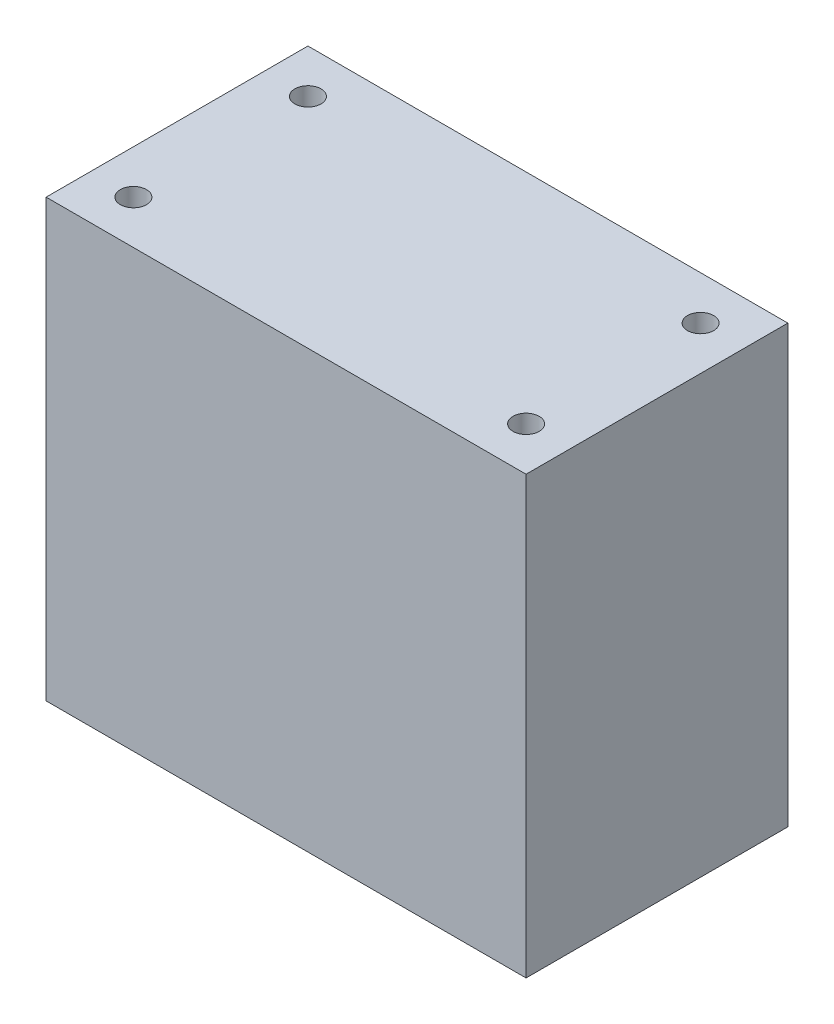
ISO-10303-21;
HEADER;
FILE_DESCRIPTION(('STEP AP214'),'2;1');
FILE_NAME('part.step','',(''),(''),'','','');
FILE_SCHEMA(('AUTOMOTIVE_DESIGN { 1 0 10303 214 1 1 1 1 }'));
ENDSEC;
DATA;
#1=APPLICATION_CONTEXT('core data for automotive mechanical design processes');
#2=APPLICATION_PROTOCOL_DEFINITION('international standard','automotive_design',2000,#1);
#3=PRODUCT_CONTEXT('',#1,'mechanical');
#4=PRODUCT('Part','Part','',(#3));
#5=PRODUCT_RELATED_PRODUCT_CATEGORY('part','',(#4));
#6=PRODUCT_DEFINITION_FORMATION('','',#4);
#7=PRODUCT_DEFINITION_CONTEXT('part definition',#1,'design');
#8=PRODUCT_DEFINITION('design','',#6,#7);
#9=PRODUCT_DEFINITION_SHAPE('','',#8);
#10=(LENGTH_UNIT() NAMED_UNIT(*) SI_UNIT(.MILLI.,.METRE.));
#11=(NAMED_UNIT(*) PLANE_ANGLE_UNIT() SI_UNIT($,.RADIAN.));
#12=(NAMED_UNIT(*) SI_UNIT($,.STERADIAN.) SOLID_ANGLE_UNIT());
#13=UNCERTAINTY_MEASURE_WITH_UNIT(LENGTH_MEASURE(1.E-05),#10,'distance_accuracy_value','');
#14=(GEOMETRIC_REPRESENTATION_CONTEXT(3) GLOBAL_UNCERTAINTY_ASSIGNED_CONTEXT((#13)) GLOBAL_UNIT_ASSIGNED_CONTEXT((#10,
#11,#12)) REPRESENTATION_CONTEXT('',''));
#15=CARTESIAN_POINT('',(0.,0.,0.));
#16=DIRECTION('',(0.,0.,1.));
#17=DIRECTION('',(1.,0.,0.));
#18=AXIS2_PLACEMENT_3D('',#15,#16,#17);
#19=CARTESIAN_POINT('',(-22.5,-17.5,-15.));
#20=DIRECTION('',(0.,1.,0.));
#21=DIRECTION('',(0.,0.,1.));
#22=AXIS2_PLACEMENT_3D('',#19,#20,#21);
#23=CYLINDRICAL_SURFACE('',#22,1.5);
#24=CARTESIAN_POINT('',(-22.5,26.,-15.));
#25=DIRECTION('',(0.,1.,0.));
#26=DIRECTION('',(0.,0.,1.));
#27=AXIS2_PLACEMENT_3D('',#24,#25,#26);
#28=CIRCLE('',#27,1.5);
#29=CARTESIAN_POINT('',(-22.5,26.,-13.5));
#30=VERTEX_POINT('',#29);
#31=EDGE_CURVE('E132',#30,#30,#28,.T.);
#32=ORIENTED_EDGE('',*,*,#31,.T.);
#33=EDGE_LOOP('',(#32));
#34=FACE_BOUND('',#33,.T.);
#35=CARTESIAN_POINT('',(-22.5,-24.,-15.));
#36=DIRECTION('',(0.,-1.,0.));
#37=DIRECTION('',(0.,0.,-1.));
#38=AXIS2_PLACEMENT_3D('',#35,#36,#37);
#39=CIRCLE('',#38,1.5);
#40=CARTESIAN_POINT('',(-22.5,-24.,-16.5));
#41=VERTEX_POINT('',#40);
#42=EDGE_CURVE('E110',#41,#41,#39,.T.);
#43=ORIENTED_EDGE('',*,*,#42,.T.);
#44=EDGE_LOOP('',(#43));
#45=FACE_BOUND('',#44,.T.);
#46=ADVANCED_FACE('F40',(#34,#45),#23,.F.);
#47=CARTESIAN_POINT('',(-22.5,-17.5,5.));
#48=DIRECTION('',(0.,1.,0.));
#49=DIRECTION('',(0.,0.,1.));
#50=AXIS2_PLACEMENT_3D('',#47,#48,#49);
#51=CYLINDRICAL_SURFACE('',#50,1.5);
#52=CARTESIAN_POINT('',(-22.5,26.,5.));
#53=DIRECTION('',(0.,1.,0.));
#54=DIRECTION('',(0.,0.,1.));
#55=AXIS2_PLACEMENT_3D('',#52,#53,#54);
#56=CIRCLE('',#55,1.5);
#57=CARTESIAN_POINT('',(-22.5,26.,6.5));
#58=VERTEX_POINT('',#57);
#59=EDGE_CURVE('E129',#58,#58,#56,.T.);
#60=ORIENTED_EDGE('',*,*,#59,.T.);
#61=EDGE_LOOP('',(#60));
#62=FACE_BOUND('',#61,.T.);
#63=CARTESIAN_POINT('',(-22.5,-24.,5.));
#64=DIRECTION('',(0.,-1.,0.));
#65=DIRECTION('',(0.,0.,-1.));
#66=AXIS2_PLACEMENT_3D('',#63,#64,#65);
#67=CIRCLE('',#66,1.5);
#68=CARTESIAN_POINT('',(-22.5,-24.,3.5));
#69=VERTEX_POINT('',#68);
#70=EDGE_CURVE('E105',#69,#69,#67,.T.);
#71=ORIENTED_EDGE('',*,*,#70,.T.);
#72=EDGE_LOOP('',(#71));
#73=FACE_BOUND('',#72,.T.);
#74=ADVANCED_FACE('F206',(#62,#73),#51,.F.);
#75=CARTESIAN_POINT('',(22.5,-17.5,5.));
#76=DIRECTION('',(0.,1.,0.));
#77=DIRECTION('',(0.,0.,1.));
#78=AXIS2_PLACEMENT_3D('',#75,#76,#77);
#79=CYLINDRICAL_SURFACE('',#78,1.5);
#80=CARTESIAN_POINT('',(22.5,26.,5.));
#81=DIRECTION('',(0.,1.,0.));
#82=DIRECTION('',(0.,0.,1.));
#83=AXIS2_PLACEMENT_3D('',#80,#81,#82);
#84=CIRCLE('',#83,1.5);
#85=CARTESIAN_POINT('',(22.5,26.,6.5));
#86=VERTEX_POINT('',#85);
#87=EDGE_CURVE('E125',#86,#86,#84,.T.);
#88=ORIENTED_EDGE('',*,*,#87,.T.);
#89=EDGE_LOOP('',(#88));
#90=FACE_BOUND('',#89,.T.);
#91=CARTESIAN_POINT('',(22.5,-24.,5.));
#92=DIRECTION('',(0.,-1.,0.));
#93=DIRECTION('',(0.,0.,-1.));
#94=AXIS2_PLACEMENT_3D('',#91,#92,#93);
#95=CIRCLE('',#94,1.5);
#96=CARTESIAN_POINT('',(22.5,-24.,3.5));
#97=VERTEX_POINT('',#96);
#98=EDGE_CURVE('E104',#97,#97,#95,.T.);
#99=ORIENTED_EDGE('',*,*,#98,.T.);
#100=EDGE_LOOP('',(#99));
#101=FACE_BOUND('',#100,.T.);
#102=ADVANCED_FACE('F213',(#90,#101),#79,.F.);
#103=CARTESIAN_POINT('',(22.5,-17.5,-15.));
#104=DIRECTION('',(0.,1.,0.));
#105=DIRECTION('',(0.,0.,1.));
#106=AXIS2_PLACEMENT_3D('',#103,#104,#105);
#107=CYLINDRICAL_SURFACE('',#106,1.5);
#108=CARTESIAN_POINT('',(22.5,26.,-15.));
#109=DIRECTION('',(0.,1.,0.));
#110=DIRECTION('',(0.,0.,1.));
#111=AXIS2_PLACEMENT_3D('',#108,#109,#110);
#112=CIRCLE('',#111,1.5);
#113=CARTESIAN_POINT('',(22.5,26.,-13.5));
#114=VERTEX_POINT('',#113);
#115=EDGE_CURVE('E128',#114,#114,#112,.T.);
#116=ORIENTED_EDGE('',*,*,#115,.T.);
#117=EDGE_LOOP('',(#116));
#118=FACE_BOUND('',#117,.T.);
#119=CARTESIAN_POINT('',(22.5,-24.,-15.));
#120=DIRECTION('',(0.,-1.,0.));
#121=DIRECTION('',(0.,0.,-1.));
#122=AXIS2_PLACEMENT_3D('',#119,#120,#121);
#123=CIRCLE('',#122,1.5);
#124=CARTESIAN_POINT('',(22.5,-24.,-16.5));
#125=VERTEX_POINT('',#124);
#126=EDGE_CURVE('E93',#125,#125,#123,.T.);
#127=ORIENTED_EDGE('',*,*,#126,.T.);
#128=EDGE_LOOP('',(#127));
#129=FACE_BOUND('',#128,.T.);
#130=ADVANCED_FACE('F201',(#118,#129),#107,.F.);
#131=CARTESIAN_POINT('',(0.,0.,-20.));
#132=DIRECTION('',(0.,0.,-1.));
#133=DIRECTION('',(-1.,0.,0.));
#134=AXIS2_PLACEMENT_3D('',#131,#132,#133);
#135=PLANE('',#134);
#136=DIRECTION('',(1.,0.,0.));
#137=VECTOR('',#136,1.);
#138=CARTESIAN_POINT('',(17.5,-24.,-20.));
#139=LINE('',#138,#137);
#140=CARTESIAN_POINT('',(-27.5,-24.,-20.));
#141=VERTEX_POINT('',#140);
#142=CARTESIAN_POINT('',(27.5,-24.,-20.));
#143=VERTEX_POINT('',#142);
#144=EDGE_CURVE('E92',#141,#143,#139,.T.);
#145=ORIENTED_EDGE('',*,*,#144,.F.);
#146=DIRECTION('',(0.,1.,0.));
#147=VECTOR('',#146,1.);
#148=CARTESIAN_POINT('',(-27.5,21.,-20.));
#149=LINE('',#148,#147);
#150=CARTESIAN_POINT('',(-27.5,26.,-20.));
#151=VERTEX_POINT('',#150);
#152=EDGE_CURVE('E103',#141,#151,#149,.T.);
#153=ORIENTED_EDGE('',*,*,#152,.T.);
#154=DIRECTION('',(1.,0.,0.));
#155=VECTOR('',#154,1.);
#156=CARTESIAN_POINT('',(-27.5,26.,-20.));
#157=LINE('',#156,#155);
#158=CARTESIAN_POINT('',(27.5,26.,-20.));
#159=VERTEX_POINT('',#158);
#160=EDGE_CURVE('E138',#151,#159,#157,.T.);
#161=ORIENTED_EDGE('',*,*,#160,.T.);
#162=DIRECTION('',(0.,-1.,0.));
#163=VECTOR('',#162,1.);
#164=CARTESIAN_POINT('',(27.5,26.,-20.));
#165=LINE('',#164,#163);
#166=EDGE_CURVE('E141',#159,#143,#165,.T.);
#167=ORIENTED_EDGE('',*,*,#166,.T.);
#168=EDGE_LOOP('',(#145,#153,#161,#167));
#169=FACE_BOUND('',#168,.T.);
#170=ADVANCED_FACE('F193',(#169),#135,.T.);
#171=CARTESIAN_POINT('',(0.,26.,10.));
#172=DIRECTION('',(0.,-1.,0.));
#173=DIRECTION('',(0.,0.,-1.));
#174=AXIS2_PLACEMENT_3D('',#171,#172,#173);
#175=PLANE('',#174);
#176=ORIENTED_EDGE('',*,*,#59,.F.);
#177=EDGE_LOOP('',(#176));
#178=FACE_BOUND('',#177,.T.);
#179=ORIENTED_EDGE('',*,*,#115,.F.);
#180=EDGE_LOOP('',(#179));
#181=FACE_BOUND('',#180,.T.);
#182=ORIENTED_EDGE('',*,*,#87,.F.);
#183=EDGE_LOOP('',(#182));
#184=FACE_BOUND('',#183,.T.);
#185=ORIENTED_EDGE('',*,*,#31,.F.);
#186=EDGE_LOOP('',(#185));
#187=FACE_BOUND('',#186,.T.);
#188=DIRECTION('',(0.,0.,-1.));
#189=VECTOR('',#188,1.);
#190=CARTESIAN_POINT('',(27.5,26.,10.));
#191=LINE('',#190,#189);
#192=CARTESIAN_POINT('',(27.5,26.,10.));
#193=VERTEX_POINT('',#192);
#194=EDGE_CURVE('E11',#193,#159,#191,.T.);
#195=ORIENTED_EDGE('',*,*,#194,.T.);
#196=ORIENTED_EDGE('',*,*,#160,.F.);
#197=DIRECTION('',(0.,0.,-1.));
#198=VECTOR('',#197,1.);
#199=CARTESIAN_POINT('',(-27.5,26.,10.));
#200=LINE('',#199,#198);
#201=CARTESIAN_POINT('',(-27.5,26.,10.));
#202=VERTEX_POINT('',#201);
#203=EDGE_CURVE('E50',#202,#151,#200,.T.);
#204=ORIENTED_EDGE('',*,*,#203,.F.);
#205=DIRECTION('',(-1.,0.,0.));
#206=VECTOR('',#205,1.);
#207=CARTESIAN_POINT('',(0.,26.,10.));
#208=LINE('',#207,#206);
#209=EDGE_CURVE('E58',#193,#202,#208,.T.);
#210=ORIENTED_EDGE('',*,*,#209,.F.);
#211=EDGE_LOOP('',(#195,#196,#204,#210));
#212=FACE_BOUND('',#211,.T.);
#213=ADVANCED_FACE('F191',(#178,#181,#184,#187,#212),#175,.F.);
#214=CARTESIAN_POINT('',(27.5,0.,10.));
#215=DIRECTION('',(1.,0.,0.));
#216=DIRECTION('',(0.,0.,-1.));
#217=AXIS2_PLACEMENT_3D('',#214,#215,#216);
#218=PLANE('',#217);
#219=DIRECTION('',(0.,-1.,0.));
#220=VECTOR('',#219,1.);
#221=CARTESIAN_POINT('',(27.5,0.,10.));
#222=LINE('',#221,#220);
#223=CARTESIAN_POINT('',(27.5,-24.,10.));
#224=VERTEX_POINT('',#223);
#225=EDGE_CURVE('E143',#193,#224,#222,.T.);
#226=ORIENTED_EDGE('',*,*,#225,.T.);
#227=DIRECTION('',(0.,0.,1.));
#228=VECTOR('',#227,1.);
#229=CARTESIAN_POINT('',(27.5,-24.,-20.));
#230=LINE('',#229,#228);
#231=EDGE_CURVE('E91',#143,#224,#230,.T.);
#232=ORIENTED_EDGE('',*,*,#231,.F.);
#233=ORIENTED_EDGE('',*,*,#166,.F.);
#234=ORIENTED_EDGE('',*,*,#194,.F.);
#235=EDGE_LOOP('',(#226,#232,#233,#234));
#236=FACE_BOUND('',#235,.T.);
#237=ADVANCED_FACE('F42',(#236),#218,.T.);
#238=CARTESIAN_POINT('',(0.,-24.,0.));
#239=DIRECTION('',(0.,-1.,0.));
#240=DIRECTION('',(0.,0.,-1.));
#241=AXIS2_PLACEMENT_3D('',#238,#239,#240);
#242=PLANE('',#241);
#243=ORIENTED_EDGE('',*,*,#126,.F.);
#244=EDGE_LOOP('',(#243));
#245=FACE_BOUND('',#244,.T.);
#246=DIRECTION('',(-1.,0.,0.));
#247=VECTOR('',#246,1.);
#248=CARTESIAN_POINT('',(27.5,-24.,10.));
#249=LINE('',#248,#247);
#250=CARTESIAN_POINT('',(-27.5,-24.,10.));
#251=VERTEX_POINT('',#250);
#252=EDGE_CURVE('E84',#224,#251,#249,.T.);
#253=ORIENTED_EDGE('',*,*,#252,.T.);
#254=DIRECTION('',(0.,0.,-1.));
#255=VECTOR('',#254,1.);
#256=CARTESIAN_POINT('',(-27.5,-24.,10.));
#257=LINE('',#256,#255);
#258=EDGE_CURVE('E89',#251,#141,#257,.T.);
#259=ORIENTED_EDGE('',*,*,#258,.T.);
#260=ORIENTED_EDGE('',*,*,#144,.T.);
#261=ORIENTED_EDGE('',*,*,#231,.T.);
#262=EDGE_LOOP('',(#253,#259,#260,#261));
#263=FACE_BOUND('',#262,.T.);
#264=ORIENTED_EDGE('',*,*,#98,.F.);
#265=EDGE_LOOP('',(#264));
#266=FACE_BOUND('',#265,.T.);
#267=ORIENTED_EDGE('',*,*,#70,.F.);
#268=EDGE_LOOP('',(#267));
#269=FACE_BOUND('',#268,.T.);
#270=ORIENTED_EDGE('',*,*,#42,.F.);
#271=EDGE_LOOP('',(#270));
#272=FACE_BOUND('',#271,.T.);
#273=ADVANCED_FACE('F85',(#245,#263,#266,#269,#272),#242,.T.);
#274=CARTESIAN_POINT('',(-27.5,0.,10.));
#275=DIRECTION('',(1.,0.,0.));
#276=DIRECTION('',(0.,0.,-1.));
#277=AXIS2_PLACEMENT_3D('',#274,#275,#276);
#278=PLANE('',#277);
#279=ORIENTED_EDGE('',*,*,#203,.T.);
#280=ORIENTED_EDGE('',*,*,#152,.F.);
#281=ORIENTED_EDGE('',*,*,#258,.F.);
#282=DIRECTION('',(0.,-1.,0.));
#283=VECTOR('',#282,1.);
#284=CARTESIAN_POINT('',(-27.5,0.,10.));
#285=LINE('',#284,#283);
#286=EDGE_CURVE('E96',#202,#251,#285,.T.);
#287=ORIENTED_EDGE('',*,*,#286,.F.);
#288=EDGE_LOOP('',(#279,#280,#281,#287));
#289=FACE_BOUND('',#288,.T.);
#290=ADVANCED_FACE('F101',(#289),#278,.F.);
#291=CARTESIAN_POINT('',(0.,0.,10.));
#292=DIRECTION('',(0.,0.,1.));
#293=DIRECTION('',(1.,0.,0.));
#294=AXIS2_PLACEMENT_3D('',#291,#292,#293);
#295=PLANE('',#294);
#296=ORIENTED_EDGE('',*,*,#286,.T.);
#297=ORIENTED_EDGE('',*,*,#252,.F.);
#298=ORIENTED_EDGE('',*,*,#225,.F.);
#299=ORIENTED_EDGE('',*,*,#209,.T.);
#300=EDGE_LOOP('',(#296,#297,#298,#299));
#301=FACE_BOUND('',#300,.T.);
#302=ADVANCED_FACE('F97',(#301),#295,.T.);
#303=CLOSED_SHELL('',(#46,#74,#102,#130,#170,#213,#237,#273,#290,#302));
#304=CARTESIAN_POINT('',(0.,0.,10.));
#305=DIRECTION('',(0.,0.,-1.));
#306=DIRECTION('',(-1.,0.,0.));
#307=AXIS2_PLACEMENT_3D('',#304,#305,#306);
#308=CYLINDRICAL_SURFACE('',#307,15.);
#309=CARTESIAN_POINT('',(0.,0.,-3.));
#310=DIRECTION('',(0.,0.,1.));
#311=DIRECTION('',(1.,0.,0.));
#312=AXIS2_PLACEMENT_3D('',#309,#310,#311);
#313=CIRCLE('',#312,15.);
#314=CARTESIAN_POINT('',(15.,0.,-3.));
#315=VERTEX_POINT('',#314);
#316=EDGE_CURVE('E118',#315,#315,#313,.T.);
#317=ORIENTED_EDGE('',*,*,#316,.F.);
#318=EDGE_LOOP('',(#317));
#319=FACE_BOUND('',#318,.T.);
#320=CARTESIAN_POINT('',(0.,0.,7.));
#321=DIRECTION('',(0.,0.,1.));
#322=DIRECTION('',(1.,0.,0.));
#323=AXIS2_PLACEMENT_3D('',#320,#321,#322);
#324=CIRCLE('',#323,15.);
#325=CARTESIAN_POINT('',(15.,0.,7.));
#326=VERTEX_POINT('',#325);
#327=EDGE_CURVE('E237',#326,#326,#324,.T.);
#328=ORIENTED_EDGE('',*,*,#327,.T.);
#329=EDGE_LOOP('',(#328));
#330=FACE_BOUND('',#329,.T.);
#331=ADVANCED_FACE('F174',(#319,#330),#308,.F.);
#332=CARTESIAN_POINT('',(0.,0.,-20.));
#333=DIRECTION('',(0.,0.,1.));
#334=DIRECTION('',(1.,0.,0.));
#335=AXIS2_PLACEMENT_3D('',#332,#333,#334);
#336=CYLINDRICAL_SURFACE('',#335,15.);
#337=CARTESIAN_POINT('',(0.,0.,-7.));
#338=DIRECTION('',(0.,0.,-1.));
#339=DIRECTION('',(-1.,0.,0.));
#340=AXIS2_PLACEMENT_3D('',#337,#338,#339);
#341=CIRCLE('',#340,15.);
#342=CARTESIAN_POINT('',(-15.,0.,-7.));
#343=VERTEX_POINT('',#342);
#344=EDGE_CURVE('E121',#343,#343,#341,.T.);
#345=ORIENTED_EDGE('',*,*,#344,.F.);
#346=EDGE_LOOP('',(#345));
#347=FACE_BOUND('',#346,.T.);
#348=CARTESIAN_POINT('',(0.,0.,-17.));
#349=DIRECTION('',(0.,0.,-1.));
#350=DIRECTION('',(-1.,0.,0.));
#351=AXIS2_PLACEMENT_3D('',#348,#349,#350);
#352=CIRCLE('',#351,15.);
#353=CARTESIAN_POINT('',(-15.,0.,-17.));
#354=VERTEX_POINT('',#353);
#355=EDGE_CURVE('E235',#354,#354,#352,.T.);
#356=ORIENTED_EDGE('',*,*,#355,.T.);
#357=EDGE_LOOP('',(#356));
#358=FACE_BOUND('',#357,.T.);
#359=ADVANCED_FACE('F154',(#347,#358),#336,.F.);
#360=CARTESIAN_POINT('',(0.,0.,-20.));
#361=DIRECTION('',(0.,0.,1.));
#362=DIRECTION('',(1.,0.,0.));
#363=AXIS2_PLACEMENT_3D('',#360,#361,#362);
#364=CYLINDRICAL_SURFACE('',#363,4.55);
#365=CARTESIAN_POINT('',(0.,0.,-7.));
#366=DIRECTION('',(0.,0.,-1.));
#367=DIRECTION('',(-1.,0.,0.));
#368=AXIS2_PLACEMENT_3D('',#365,#366,#367);
#369=CIRCLE('',#368,4.55);
#370=CARTESIAN_POINT('',(-4.55,0.,-7.));
#371=VERTEX_POINT('',#370);
#372=EDGE_CURVE('E124',#371,#371,#369,.F.);
#373=ORIENTED_EDGE('',*,*,#372,.F.);
#374=EDGE_LOOP('',(#373));
#375=FACE_BOUND('',#374,.T.);
#376=CARTESIAN_POINT('',(0.,0.,-3.));
#377=DIRECTION('',(0.,0.,1.));
#378=DIRECTION('',(1.,0.,0.));
#379=AXIS2_PLACEMENT_3D('',#376,#377,#378);
#380=CIRCLE('',#379,4.55);
#381=CARTESIAN_POINT('',(4.55,0.,-3.));
#382=VERTEX_POINT('',#381);
#383=EDGE_CURVE('E44',#382,#382,#380,.F.);
#384=ORIENTED_EDGE('',*,*,#383,.F.);
#385=EDGE_LOOP('',(#384));
#386=FACE_BOUND('',#385,.T.);
#387=ADVANCED_FACE('F151',(#375,#386),#364,.F.);
#388=CARTESIAN_POINT('',(0.,0.,-7.));
#389=DIRECTION('',(0.,0.,-1.));
#390=DIRECTION('',(-1.,0.,0.));
#391=AXIS2_PLACEMENT_3D('',#388,#389,#390);
#392=PLANE('',#391);
#393=ORIENTED_EDGE('',*,*,#344,.T.);
#394=EDGE_LOOP('',(#393));
#395=FACE_BOUND('',#394,.T.);
#396=ORIENTED_EDGE('',*,*,#372,.T.);
#397=EDGE_LOOP('',(#396));
#398=FACE_BOUND('',#397,.T.);
#399=ADVANCED_FACE('F149',(#395,#398),#392,.T.);
#400=CARTESIAN_POINT('',(0.,0.,-3.));
#401=DIRECTION('',(0.,0.,1.));
#402=DIRECTION('',(1.,0.,0.));
#403=AXIS2_PLACEMENT_3D('',#400,#401,#402);
#404=PLANE('',#403);
#405=ORIENTED_EDGE('',*,*,#316,.T.);
#406=EDGE_LOOP('',(#405));
#407=FACE_BOUND('',#406,.T.);
#408=ORIENTED_EDGE('',*,*,#383,.T.);
#409=EDGE_LOOP('',(#408));
#410=FACE_BOUND('',#409,.T.);
#411=ADVANCED_FACE('F160',(#407,#410),#404,.T.);
#412=CARTESIAN_POINT('',(0.,0.,-17.));
#413=DIRECTION('',(0.,0.,-1.));
#414=DIRECTION('',(-1.,0.,0.));
#415=AXIS2_PLACEMENT_3D('',#412,#413,#414);
#416=PLANE('',#415);
#417=ORIENTED_EDGE('',*,*,#355,.F.);
#418=EDGE_LOOP('',(#417));
#419=FACE_BOUND('',#418,.T.);
#420=ADVANCED_FACE('F162',(#419),#416,.F.);
#421=CARTESIAN_POINT('',(0.,0.,7.));
#422=DIRECTION('',(0.,0.,1.));
#423=DIRECTION('',(1.,0.,0.));
#424=AXIS2_PLACEMENT_3D('',#421,#422,#423);
#425=PLANE('',#424);
#426=ORIENTED_EDGE('',*,*,#327,.F.);
#427=EDGE_LOOP('',(#426));
#428=FACE_BOUND('',#427,.T.);
#429=ADVANCED_FACE('F169',(#428),#425,.F.);
#430=CLOSED_SHELL('',(#331,#359,#387,#399,#411,#420,#429));
#431=ORIENTED_CLOSED_SHELL('',*,#430,.T.);
#432=BREP_WITH_VOIDS('B2',#303,(#431));
#433=ADVANCED_BREP_SHAPE_REPRESENTATION('',(#18,#432),#14);
#434=SHAPE_DEFINITION_REPRESENTATION(#9,#433);
ENDSEC;
END-ISO-10303-21;
